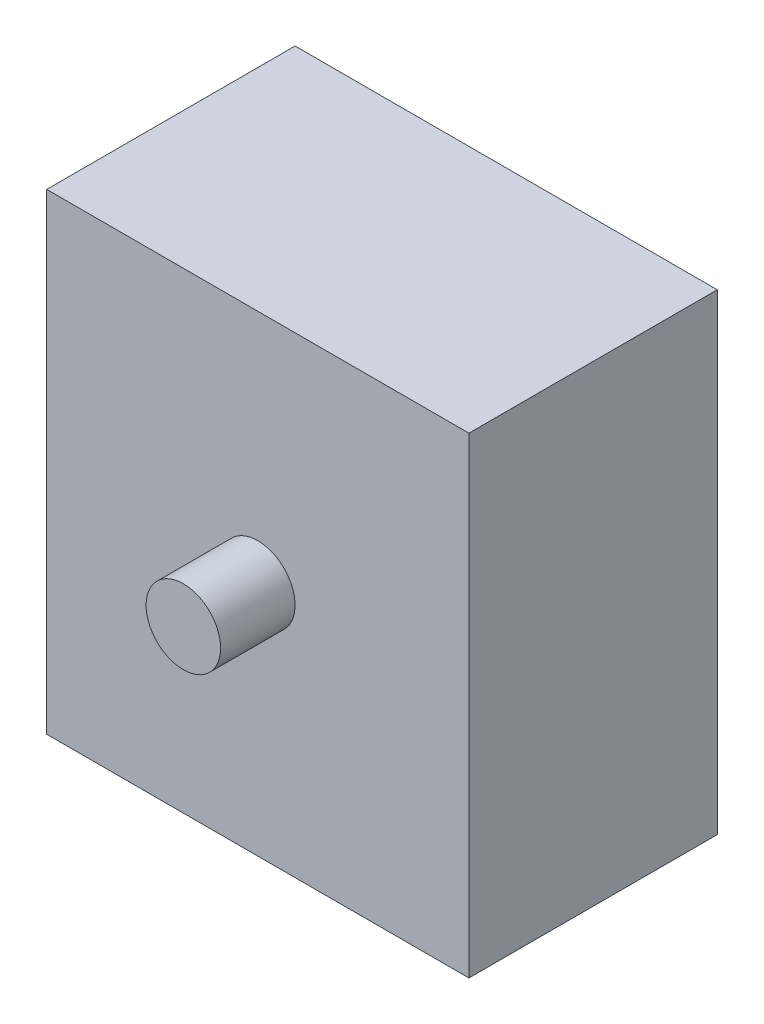
ISO-10303-21;
HEADER;
FILE_DESCRIPTION(('STEP AP214'),'2;1');
FILE_NAME('part.step','',(''),(''),'','','');
FILE_SCHEMA(('AUTOMOTIVE_DESIGN { 1 0 10303 214 1 1 1 1 }'));
ENDSEC;
DATA;
#1=APPLICATION_CONTEXT('core data for automotive mechanical design processes');
#2=APPLICATION_PROTOCOL_DEFINITION('international standard','automotive_design',2000,#1);
#3=PRODUCT_CONTEXT('',#1,'mechanical');
#4=PRODUCT('Part','Part','',(#3));
#5=PRODUCT_RELATED_PRODUCT_CATEGORY('part','',(#4));
#6=PRODUCT_DEFINITION_FORMATION('','',#4);
#7=PRODUCT_DEFINITION_CONTEXT('part definition',#1,'design');
#8=PRODUCT_DEFINITION('design','',#6,#7);
#9=PRODUCT_DEFINITION_SHAPE('','',#8);
#10=(LENGTH_UNIT() NAMED_UNIT(*) SI_UNIT(.MILLI.,.METRE.));
#11=(NAMED_UNIT(*) PLANE_ANGLE_UNIT() SI_UNIT($,.RADIAN.));
#12=(NAMED_UNIT(*) SI_UNIT($,.STERADIAN.) SOLID_ANGLE_UNIT());
#13=UNCERTAINTY_MEASURE_WITH_UNIT(LENGTH_MEASURE(1.E-05),#10,'distance_accuracy_value','');
#14=(GEOMETRIC_REPRESENTATION_CONTEXT(3) GLOBAL_UNCERTAINTY_ASSIGNED_CONTEXT((#13)) GLOBAL_UNIT_ASSIGNED_CONTEXT((#10,
#11,#12)) REPRESENTATION_CONTEXT('',''));
#15=CARTESIAN_POINT('',(0.,0.,0.));
#16=DIRECTION('',(0.,0.,1.));
#17=DIRECTION('',(1.,0.,0.));
#18=AXIS2_PLACEMENT_3D('',#15,#16,#17);
#19=CARTESIAN_POINT('',(-8.5,-9.5,-10.));
#20=DIRECTION('',(1.,0.,0.));
#21=DIRECTION('',(0.,0.,-1.));
#22=AXIS2_PLACEMENT_3D('',#19,#20,#21);
#23=PLANE('',#22);
#24=DIRECTION('',(0.,1.,0.));
#25=VECTOR('',#24,1.);
#26=CARTESIAN_POINT('',(-8.5,-9.5,0.));
#27=LINE('',#26,#25);
#28=CARTESIAN_POINT('',(-8.5,-9.5,0.));
#29=VERTEX_POINT('',#28);
#30=CARTESIAN_POINT('',(-8.5,9.5,0.));
#31=VERTEX_POINT('',#30);
#32=EDGE_CURVE('E98',#29,#31,#27,.T.);
#33=ORIENTED_EDGE('',*,*,#32,.T.);
#34=DIRECTION('',(0.,0.,1.));
#35=VECTOR('',#34,1.);
#36=CARTESIAN_POINT('',(-8.5,9.5,-10.));
#37=LINE('',#36,#35);
#38=CARTESIAN_POINT('',(-8.5,9.5,-10.));
#39=VERTEX_POINT('',#38);
#40=EDGE_CURVE('E40',#39,#31,#37,.T.);
#41=ORIENTED_EDGE('',*,*,#40,.F.);
#42=DIRECTION('',(0.,1.,0.));
#43=VECTOR('',#42,1.);
#44=CARTESIAN_POINT('',(-8.5,-9.5,-10.));
#45=LINE('',#44,#43);
#46=CARTESIAN_POINT('',(-8.5,-9.5,-10.));
#47=VERTEX_POINT('',#46);
#48=EDGE_CURVE('E82',#47,#39,#45,.T.);
#49=ORIENTED_EDGE('',*,*,#48,.F.);
#50=DIRECTION('',(0.,0.,1.));
#51=VECTOR('',#50,1.);
#52=CARTESIAN_POINT('',(-8.5,-9.5,-10.));
#53=LINE('',#52,#51);
#54=EDGE_CURVE('E48',#47,#29,#53,.T.);
#55=ORIENTED_EDGE('',*,*,#54,.T.);
#56=EDGE_LOOP('',(#33,#41,#49,#55));
#57=FACE_BOUND('',#56,.T.);
#58=ADVANCED_FACE('F32',(#57),#23,.F.);
#59=CARTESIAN_POINT('',(-8.5,9.5,-10.));
#60=DIRECTION('',(0.,-1.,0.));
#61=DIRECTION('',(0.,0.,-1.));
#62=AXIS2_PLACEMENT_3D('',#59,#60,#61);
#63=PLANE('',#62);
#64=DIRECTION('',(1.,0.,0.));
#65=VECTOR('',#64,1.);
#66=CARTESIAN_POINT('',(-8.5,9.5,0.));
#67=LINE('',#66,#65);
#68=CARTESIAN_POINT('',(8.5,9.5,0.));
#69=VERTEX_POINT('',#68);
#70=EDGE_CURVE('E88',#31,#69,#67,.T.);
#71=ORIENTED_EDGE('',*,*,#70,.T.);
#72=DIRECTION('',(0.,0.,1.));
#73=VECTOR('',#72,1.);
#74=CARTESIAN_POINT('',(8.5,9.5,-10.));
#75=LINE('',#74,#73);
#76=CARTESIAN_POINT('',(8.5,9.5,-10.));
#77=VERTEX_POINT('',#76);
#78=EDGE_CURVE('E86',#77,#69,#75,.T.);
#79=ORIENTED_EDGE('',*,*,#78,.F.);
#80=DIRECTION('',(1.,0.,0.));
#81=VECTOR('',#80,1.);
#82=CARTESIAN_POINT('',(-8.5,9.5,-10.));
#83=LINE('',#82,#81);
#84=EDGE_CURVE('E74',#39,#77,#83,.T.);
#85=ORIENTED_EDGE('',*,*,#84,.F.);
#86=ORIENTED_EDGE('',*,*,#40,.T.);
#87=EDGE_LOOP('',(#71,#79,#85,#86));
#88=FACE_BOUND('',#87,.T.);
#89=ADVANCED_FACE('F87',(#88),#63,.F.);
#90=CARTESIAN_POINT('',(8.5,-9.5,-10.));
#91=DIRECTION('',(1.,0.,0.));
#92=DIRECTION('',(0.,0.,-1.));
#93=AXIS2_PLACEMENT_3D('',#90,#91,#92);
#94=PLANE('',#93);
#95=DIRECTION('',(0.,1.,0.));
#96=VECTOR('',#95,1.);
#97=CARTESIAN_POINT('',(8.5,-9.5,0.));
#98=LINE('',#97,#96);
#99=CARTESIAN_POINT('',(8.5,-9.5,0.));
#100=VERTEX_POINT('',#99);
#101=EDGE_CURVE('E102',#100,#69,#98,.T.);
#102=ORIENTED_EDGE('',*,*,#101,.F.);
#103=DIRECTION('',(0.,0.,1.));
#104=VECTOR('',#103,1.);
#105=CARTESIAN_POINT('',(8.5,-9.5,-10.));
#106=LINE('',#105,#104);
#107=CARTESIAN_POINT('',(8.5,-9.5,-10.));
#108=VERTEX_POINT('',#107);
#109=EDGE_CURVE('E62',#108,#100,#106,.T.);
#110=ORIENTED_EDGE('',*,*,#109,.F.);
#111=DIRECTION('',(0.,1.,0.));
#112=VECTOR('',#111,1.);
#113=CARTESIAN_POINT('',(8.5,-9.5,-10.));
#114=LINE('',#113,#112);
#115=EDGE_CURVE('E81',#108,#77,#114,.T.);
#116=ORIENTED_EDGE('',*,*,#115,.T.);
#117=ORIENTED_EDGE('',*,*,#78,.T.);
#118=EDGE_LOOP('',(#102,#110,#116,#117));
#119=FACE_BOUND('',#118,.T.);
#120=ADVANCED_FACE('F92',(#119),#94,.T.);
#121=CARTESIAN_POINT('',(-8.5,-9.5,-10.));
#122=DIRECTION('',(0.,-1.,0.));
#123=DIRECTION('',(0.,0.,-1.));
#124=AXIS2_PLACEMENT_3D('',#121,#122,#123);
#125=PLANE('',#124);
#126=DIRECTION('',(1.,0.,0.));
#127=VECTOR('',#126,1.);
#128=CARTESIAN_POINT('',(-8.5,-9.5,0.));
#129=LINE('',#128,#127);
#130=EDGE_CURVE('E104',#29,#100,#129,.T.);
#131=ORIENTED_EDGE('',*,*,#130,.F.);
#132=ORIENTED_EDGE('',*,*,#54,.F.);
#133=DIRECTION('',(1.,0.,0.));
#134=VECTOR('',#133,1.);
#135=CARTESIAN_POINT('',(-8.5,-9.5,-10.));
#136=LINE('',#135,#134);
#137=EDGE_CURVE('E93',#47,#108,#136,.T.);
#138=ORIENTED_EDGE('',*,*,#137,.T.);
#139=ORIENTED_EDGE('',*,*,#109,.T.);
#140=EDGE_LOOP('',(#131,#132,#138,#139));
#141=FACE_BOUND('',#140,.T.);
#142=ADVANCED_FACE('F110',(#141),#125,.T.);
#143=CARTESIAN_POINT('',(0.,0.,-10.));
#144=DIRECTION('',(0.,0.,-1.));
#145=DIRECTION('',(-1.,0.,0.));
#146=AXIS2_PLACEMENT_3D('',#143,#144,#145);
#147=PLANE('',#146);
#148=ORIENTED_EDGE('',*,*,#48,.T.);
#149=ORIENTED_EDGE('',*,*,#84,.T.);
#150=ORIENTED_EDGE('',*,*,#115,.F.);
#151=ORIENTED_EDGE('',*,*,#137,.F.);
#152=EDGE_LOOP('',(#148,#149,#150,#151));
#153=FACE_BOUND('',#152,.T.);
#154=ADVANCED_FACE('F78',(#153),#147,.T.);
#155=CARTESIAN_POINT('',(0.,0.,0.));
#156=DIRECTION('',(0.,0.,-1.));
#157=DIRECTION('',(-1.,0.,0.));
#158=AXIS2_PLACEMENT_3D('',#155,#156,#157);
#159=PLANE('',#158);
#160=CARTESIAN_POINT('',(0.,0.,0.));
#161=DIRECTION('',(0.,0.,-1.));
#162=DIRECTION('',(-1.,0.,0.));
#163=AXIS2_PLACEMENT_3D('',#160,#161,#162);
#164=CIRCLE('',#163,1.5);
#165=CARTESIAN_POINT('',(-1.5,0.,0.));
#166=VERTEX_POINT('',#165);
#167=EDGE_CURVE('E11',#166,#166,#164,.F.);
#168=ORIENTED_EDGE('',*,*,#167,.F.);
#169=EDGE_LOOP('',(#168));
#170=FACE_BOUND('',#169,.T.);
#171=ORIENTED_EDGE('',*,*,#32,.F.);
#172=ORIENTED_EDGE('',*,*,#130,.T.);
#173=ORIENTED_EDGE('',*,*,#101,.T.);
#174=ORIENTED_EDGE('',*,*,#70,.F.);
#175=EDGE_LOOP('',(#171,#172,#173,#174));
#176=FACE_BOUND('',#175,.T.);
#177=ADVANCED_FACE('F109',(#170,#176),#159,.F.);
#178=CARTESIAN_POINT('',(0.,0.,3.));
#179=DIRECTION('',(0.,0.,-1.));
#180=DIRECTION('',(-1.,0.,0.));
#181=AXIS2_PLACEMENT_3D('',#178,#179,#180);
#182=CYLINDRICAL_SURFACE('',#181,1.5);
#183=CARTESIAN_POINT('',(0.,0.,3.));
#184=DIRECTION('',(0.,0.,1.));
#185=DIRECTION('',(1.,0.,0.));
#186=AXIS2_PLACEMENT_3D('',#183,#184,#185);
#187=CIRCLE('',#186,1.5);
#188=CARTESIAN_POINT('',(1.5,0.,3.));
#189=VERTEX_POINT('',#188);
#190=EDGE_CURVE('E100',#189,#189,#187,.T.);
#191=ORIENTED_EDGE('',*,*,#190,.F.);
#192=EDGE_LOOP('',(#191));
#193=FACE_BOUND('',#192,.T.);
#194=ORIENTED_EDGE('',*,*,#167,.T.);
#195=EDGE_LOOP('',(#194));
#196=FACE_BOUND('',#195,.T.);
#197=ADVANCED_FACE('F149',(#193,#196),#182,.T.);
#198=CARTESIAN_POINT('',(0.,0.,3.));
#199=DIRECTION('',(0.,0.,1.));
#200=DIRECTION('',(1.,0.,0.));
#201=AXIS2_PLACEMENT_3D('',#198,#199,#200);
#202=PLANE('',#201);
#203=ORIENTED_EDGE('',*,*,#190,.T.);
#204=EDGE_LOOP('',(#203));
#205=FACE_BOUND('',#204,.T.);
#206=ADVANCED_FACE('F158',(#205),#202,.T.);
#207=CLOSED_SHELL('',(#58,#89,#120,#142,#154,#177,#197,#206));
#208=MANIFOLD_SOLID_BREP('B2',#207);
#209=ADVANCED_BREP_SHAPE_REPRESENTATION('',(#18,#208),#14);
#210=SHAPE_DEFINITION_REPRESENTATION(#9,#209);
ENDSEC;
END-ISO-10303-21;
